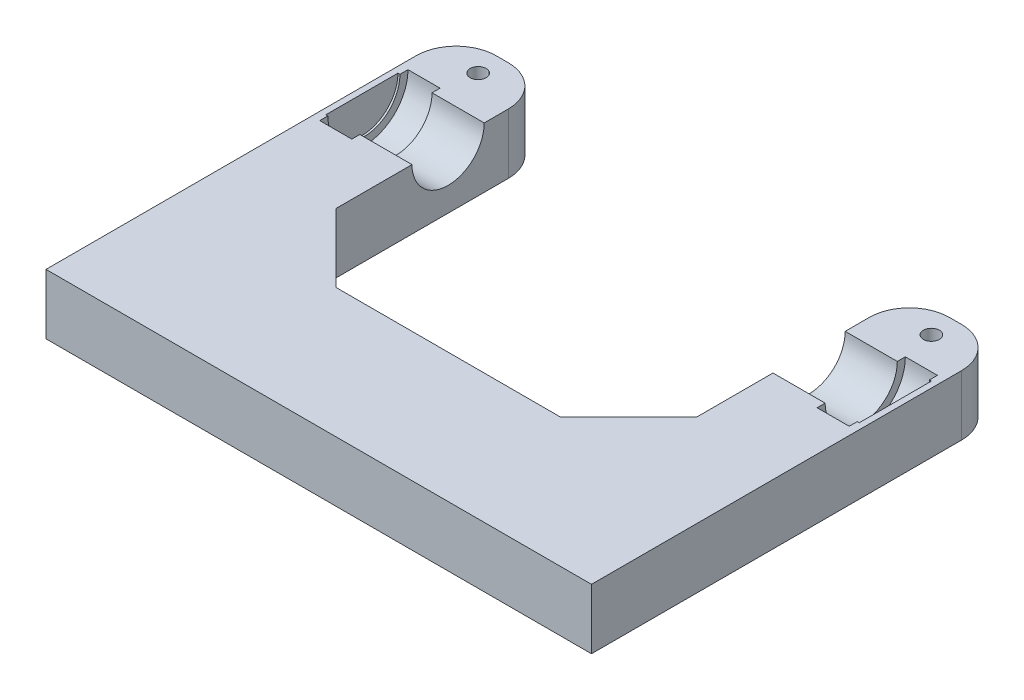
ISO-10303-21;
HEADER;
FILE_DESCRIPTION(('STEP AP214'),'2;1');
FILE_NAME('part.step','',(''),(''),'','','');
FILE_SCHEMA(('AUTOMOTIVE_DESIGN { 1 0 10303 214 1 1 1 1 }'));
ENDSEC;
DATA;
#1=APPLICATION_CONTEXT('core data for automotive mechanical design processes');
#2=APPLICATION_PROTOCOL_DEFINITION('international standard','automotive_design',2000,#1);
#3=PRODUCT_CONTEXT('',#1,'mechanical');
#4=PRODUCT('Part','Part','',(#3));
#5=PRODUCT_RELATED_PRODUCT_CATEGORY('part','',(#4));
#6=PRODUCT_DEFINITION_FORMATION('','',#4);
#7=PRODUCT_DEFINITION_CONTEXT('part definition',#1,'design');
#8=PRODUCT_DEFINITION('design','',#6,#7);
#9=PRODUCT_DEFINITION_SHAPE('','',#8);
#10=(LENGTH_UNIT() NAMED_UNIT(*) SI_UNIT(.MILLI.,.METRE.));
#11=(NAMED_UNIT(*) PLANE_ANGLE_UNIT() SI_UNIT($,.RADIAN.));
#12=(NAMED_UNIT(*) SI_UNIT($,.STERADIAN.) SOLID_ANGLE_UNIT());
#13=UNCERTAINTY_MEASURE_WITH_UNIT(LENGTH_MEASURE(1.E-05),#10,'distance_accuracy_value','');
#14=(GEOMETRIC_REPRESENTATION_CONTEXT(3) GLOBAL_UNCERTAINTY_ASSIGNED_CONTEXT((#13)) GLOBAL_UNIT_ASSIGNED_CONTEXT((#10,
#11,#12)) REPRESENTATION_CONTEXT('',''));
#15=CARTESIAN_POINT('',(0.,0.,0.));
#16=DIRECTION('',(0.,0.,1.));
#17=DIRECTION('',(1.,0.,0.));
#18=AXIS2_PLACEMENT_3D('',#15,#16,#17);
#19=CARTESIAN_POINT('',(0.,0.,0.));
#20=DIRECTION('',(0.,1.,0.));
#21=DIRECTION('',(0.,0.,1.));
#22=AXIS2_PLACEMENT_3D('',#19,#20,#21);
#23=PLANE('',#22);
#24=CARTESIAN_POINT('',(56.5,0.,-19.));
#25=DIRECTION('',(0.,-1.,0.));
#26=DIRECTION('',(0.,0.,1.));
#27=AXIS2_PLACEMENT_3D('',#24,#25,#26);
#28=CIRCLE('',#27,2.);
#29=CARTESIAN_POINT('',(56.5,0.,-17.));
#30=VERTEX_POINT('',#29);
#31=EDGE_CURVE('E478',#30,#30,#28,.T.);
#32=ORIENTED_EDGE('',*,*,#31,.T.);
#33=EDGE_LOOP('',(#32));
#34=FACE_BOUND('',#33,.T.);
#35=CARTESIAN_POINT('',(-56.5,0.,-19.));
#36=DIRECTION('',(0.,1.,0.));
#37=DIRECTION('',(0.,0.,1.));
#38=AXIS2_PLACEMENT_3D('',#35,#36,#37);
#39=CIRCLE('',#38,2.);
#40=CARTESIAN_POINT('',(-56.5,0.,-17.));
#41=VERTEX_POINT('',#40);
#42=EDGE_CURVE('E253',#41,#41,#39,.T.);
#43=ORIENTED_EDGE('',*,*,#42,.F.);
#44=EDGE_LOOP('',(#43));
#45=FACE_BOUND('',#44,.T.);
#46=DIRECTION('',(-1.,0.,0.));
#47=VECTOR('',#46,1.);
#48=CARTESIAN_POINT('',(66.,0.,-11.));
#49=LINE('',#48,#47);
#50=CARTESIAN_POINT('',(58.,0.,-11.));
#51=VERTEX_POINT('',#50);
#52=CARTESIAN_POINT('',(66.,0.,-11.));
#53=VERTEX_POINT('',#52);
#54=EDGE_CURVE('E11',#51,#53,#49,.F.);
#55=ORIENTED_EDGE('',*,*,#54,.T.);
#56=DIRECTION('',(0.,0.,1.));
#57=VECTOR('',#56,1.);
#58=CARTESIAN_POINT('',(66.,0.,0.));
#59=LINE('',#58,#57);
#60=CARTESIAN_POINT('',(66.,0.,-9.));
#61=VERTEX_POINT('',#60);
#62=EDGE_CURVE('E237',#53,#61,#59,.T.);
#63=ORIENTED_EDGE('',*,*,#62,.T.);
#64=DIRECTION('',(-1.,0.,0.));
#65=VECTOR('',#64,1.);
#66=CARTESIAN_POINT('',(66.5,0.,-9.));
#67=LINE('',#66,#65);
#68=CARTESIAN_POINT('',(66.5,0.,-9.));
#69=VERTEX_POINT('',#68);
#70=EDGE_CURVE('E250',#61,#69,#67,.F.);
#71=ORIENTED_EDGE('',*,*,#70,.T.);
#72=DIRECTION('',(0.,0.,1.));
#73=VECTOR('',#72,1.);
#74=CARTESIAN_POINT('',(66.5,0.,0.));
#75=LINE('',#74,#73);
#76=CARTESIAN_POINT('',(66.5,0.,9.));
#77=VERTEX_POINT('',#76);
#78=EDGE_CURVE('E462',#69,#77,#75,.T.);
#79=ORIENTED_EDGE('',*,*,#78,.T.);
#80=DIRECTION('',(-1.,0.,0.));
#81=VECTOR('',#80,1.);
#82=CARTESIAN_POINT('',(66.5,0.,9.));
#83=LINE('',#82,#81);
#84=CARTESIAN_POINT('',(66.,0.,9.));
#85=VERTEX_POINT('',#84);
#86=EDGE_CURVE('E246',#77,#85,#83,.T.);
#87=ORIENTED_EDGE('',*,*,#86,.T.);
#88=CARTESIAN_POINT('',(66.,0.,11.));
#89=VERTEX_POINT('',#88);
#90=EDGE_CURVE('E232',#85,#89,#59,.T.);
#91=ORIENTED_EDGE('',*,*,#90,.T.);
#92=DIRECTION('',(-1.,0.,0.));
#93=VECTOR('',#92,1.);
#94=CARTESIAN_POINT('',(66.,0.,11.));
#95=LINE('',#94,#93);
#96=CARTESIAN_POINT('',(58.,0.,11.));
#97=VERTEX_POINT('',#96);
#98=EDGE_CURVE('E50',#89,#97,#95,.T.);
#99=ORIENTED_EDGE('',*,*,#98,.T.);
#100=DIRECTION('',(0.,0.,1.));
#101=VECTOR('',#100,1.);
#102=CARTESIAN_POINT('',(58.,0.,0.));
#103=LINE('',#102,#101);
#104=CARTESIAN_POINT('',(58.,0.,9.));
#105=VERTEX_POINT('',#104);
#106=EDGE_CURVE('E226',#105,#97,#103,.T.);
#107=ORIENTED_EDGE('',*,*,#106,.F.);
#108=CARTESIAN_POINT('',(45.,0.,9.));
#109=VERTEX_POINT('',#108);
#110=EDGE_CURVE('E245',#105,#109,#83,.T.);
#111=ORIENTED_EDGE('',*,*,#110,.T.);
#112=DIRECTION('',(0.,0.,1.));
#113=VECTOR('',#112,1.);
#114=CARTESIAN_POINT('',(45.,0.,-25.));
#115=LINE('',#114,#113);
#116=CARTESIAN_POINT('',(45.,0.,27.9999999999999));
#117=VERTEX_POINT('',#116);
#118=EDGE_CURVE('E285',#109,#117,#115,.T.);
#119=ORIENTED_EDGE('',*,*,#118,.T.);
#120=DIRECTION('',(0.707106781186544,0.,-0.707106781186551));
#121=VECTOR('',#120,1.);
#122=CARTESIAN_POINT('',(45.,0.,27.9999999999999));
#123=LINE('',#122,#121);
#124=CARTESIAN_POINT('',(28.0000000000001,0.,45.));
#125=VERTEX_POINT('',#124);
#126=EDGE_CURVE('E394',#117,#125,#123,.F.);
#127=ORIENTED_EDGE('',*,*,#126,.T.);
#128=DIRECTION('',(-1.,0.,0.));
#129=VECTOR('',#128,1.);
#130=CARTESIAN_POINT('',(-45.,0.,45.));
#131=LINE('',#130,#129);
#132=CARTESIAN_POINT('',(-27.9999999999998,0.,45.));
#133=VERTEX_POINT('',#132);
#134=EDGE_CURVE('E321',#125,#133,#131,.T.);
#135=ORIENTED_EDGE('',*,*,#134,.T.);
#136=DIRECTION('',(0.707106781186551,0.,0.707106781186544));
#137=VECTOR('',#136,1.);
#138=CARTESIAN_POINT('',(-27.9999999999998,0.,45.));
#139=LINE('',#138,#137);
#140=CARTESIAN_POINT('',(-45.,0.,28.0000000000001));
#141=VERTEX_POINT('',#140);
#142=EDGE_CURVE('E401',#133,#141,#139,.F.);
#143=ORIENTED_EDGE('',*,*,#142,.T.);
#144=DIRECTION('',(0.,0.,-1.));
#145=VECTOR('',#144,1.);
#146=CARTESIAN_POINT('',(-45.,0.,45.));
#147=LINE('',#146,#145);
#148=CARTESIAN_POINT('',(-45.,0.,9.));
#149=VERTEX_POINT('',#148);
#150=EDGE_CURVE('E326',#141,#149,#147,.T.);
#151=ORIENTED_EDGE('',*,*,#150,.T.);
#152=DIRECTION('',(1.,0.,0.));
#153=VECTOR('',#152,1.);
#154=CARTESIAN_POINT('',(-66.5,0.,9.));
#155=LINE('',#154,#153);
#156=CARTESIAN_POINT('',(-58.,0.,9.));
#157=VERTEX_POINT('',#156);
#158=EDGE_CURVE('E362',#157,#149,#155,.T.);
#159=ORIENTED_EDGE('',*,*,#158,.F.);
#160=DIRECTION('',(0.,0.,-1.));
#161=VECTOR('',#160,1.);
#162=CARTESIAN_POINT('',(-58.,0.,0.));
#163=LINE('',#162,#161);
#164=CARTESIAN_POINT('',(-58.,0.,11.));
#165=VERTEX_POINT('',#164);
#166=EDGE_CURVE('E272',#165,#157,#163,.T.);
#167=ORIENTED_EDGE('',*,*,#166,.F.);
#168=DIRECTION('',(1.,0.,0.));
#169=VECTOR('',#168,1.);
#170=CARTESIAN_POINT('',(-66.,0.,11.));
#171=LINE('',#170,#169);
#172=CARTESIAN_POINT('',(-66.,0.,11.));
#173=VERTEX_POINT('',#172);
#174=EDGE_CURVE('E377',#173,#165,#171,.T.);
#175=ORIENTED_EDGE('',*,*,#174,.F.);
#176=DIRECTION('',(0.,0.,-1.));
#177=VECTOR('',#176,1.);
#178=CARTESIAN_POINT('',(-66.,0.,0.));
#179=LINE('',#178,#177);
#180=CARTESIAN_POINT('',(-66.,0.,9.));
#181=VERTEX_POINT('',#180);
#182=EDGE_CURVE('E277',#173,#181,#179,.T.);
#183=ORIENTED_EDGE('',*,*,#182,.T.);
#184=CARTESIAN_POINT('',(-66.5,0.,9.));
#185=VERTEX_POINT('',#184);
#186=EDGE_CURVE('E363',#185,#181,#155,.T.);
#187=ORIENTED_EDGE('',*,*,#186,.F.);
#188=DIRECTION('',(0.,0.,-1.));
#189=VECTOR('',#188,1.);
#190=CARTESIAN_POINT('',(-66.5,0.,0.));
#191=LINE('',#190,#189);
#192=CARTESIAN_POINT('',(-66.5,0.,-9.));
#193=VERTEX_POINT('',#192);
#194=EDGE_CURVE('E350',#185,#193,#191,.T.);
#195=ORIENTED_EDGE('',*,*,#194,.T.);
#196=DIRECTION('',(1.,0.,0.));
#197=VECTOR('',#196,1.);
#198=CARTESIAN_POINT('',(-66.5,0.,-9.));
#199=LINE('',#198,#197);
#200=CARTESIAN_POINT('',(-66.,0.,-9.));
#201=VERTEX_POINT('',#200);
#202=EDGE_CURVE('E357',#201,#193,#199,.F.);
#203=ORIENTED_EDGE('',*,*,#202,.F.);
#204=CARTESIAN_POINT('',(-66.,0.,-11.));
#205=VERTEX_POINT('',#204);
#206=EDGE_CURVE('E273',#201,#205,#179,.T.);
#207=ORIENTED_EDGE('',*,*,#206,.T.);
#208=DIRECTION('',(1.,0.,0.));
#209=VECTOR('',#208,1.);
#210=CARTESIAN_POINT('',(-66.,0.,-11.));
#211=LINE('',#210,#209);
#212=CARTESIAN_POINT('',(-58.,0.,-11.));
#213=VERTEX_POINT('',#212);
#214=EDGE_CURVE('E374',#213,#205,#211,.F.);
#215=ORIENTED_EDGE('',*,*,#214,.F.);
#216=CARTESIAN_POINT('',(-58.,0.,-9.));
#217=VERTEX_POINT('',#216);
#218=EDGE_CURVE('E266',#217,#213,#163,.T.);
#219=ORIENTED_EDGE('',*,*,#218,.F.);
#220=CARTESIAN_POINT('',(-45.,0.,-9.));
#221=VERTEX_POINT('',#220);
#222=EDGE_CURVE('E358',#221,#217,#199,.F.);
#223=ORIENTED_EDGE('',*,*,#222,.F.);
#224=CARTESIAN_POINT('',(-45.,0.,-15.));
#225=VERTEX_POINT('',#224);
#226=EDGE_CURVE('E325',#221,#225,#147,.T.);
#227=ORIENTED_EDGE('',*,*,#226,.T.);
#228=CARTESIAN_POINT('',(-55.,0.,-15.));
#229=DIRECTION('',(0.,1.,0.));
#230=DIRECTION('',(0.,0.,1.));
#231=AXIS2_PLACEMENT_3D('',#228,#229,#230);
#232=CIRCLE('',#231,10.);
#233=CARTESIAN_POINT('',(-55.,0.,-25.));
#234=VERTEX_POINT('',#233);
#235=EDGE_CURVE('E414',#225,#234,#232,.T.);
#236=ORIENTED_EDGE('',*,*,#235,.T.);
#237=DIRECTION('',(-1.,0.,0.));
#238=VECTOR('',#237,1.);
#239=CARTESIAN_POINT('',(-45.,0.,-25.));
#240=LINE('',#239,#238);
#241=CARTESIAN_POINT('',(-58.,0.,-25.));
#242=VERTEX_POINT('',#241);
#243=EDGE_CURVE('E329',#234,#242,#240,.T.);
#244=ORIENTED_EDGE('',*,*,#243,.T.);
#245=CARTESIAN_POINT('',(-58.,0.,-15.));
#246=DIRECTION('',(0.,1.,0.));
#247=DIRECTION('',(0.,0.,1.));
#248=AXIS2_PLACEMENT_3D('',#245,#246,#247);
#249=CIRCLE('',#248,10.);
#250=CARTESIAN_POINT('',(-67.9999999999999,0.,-15.));
#251=VERTEX_POINT('',#250);
#252=EDGE_CURVE('E411',#242,#251,#249,.T.);
#253=ORIENTED_EDGE('',*,*,#252,.T.);
#254=DIRECTION('',(0.,0.,1.));
#255=VECTOR('',#254,1.);
#256=CARTESIAN_POINT('',(-67.9999999999999,0.,-25.));
#257=LINE('',#256,#255);
#258=CARTESIAN_POINT('',(-67.9999999999999,0.,77.2494482032354));
#259=VERTEX_POINT('',#258);
#260=EDGE_CURVE('E333',#251,#259,#257,.T.);
#261=ORIENTED_EDGE('',*,*,#260,.T.);
#262=DIRECTION('',(1.,0.,0.));
#263=VECTOR('',#262,1.);
#264=CARTESIAN_POINT('',(-67.9999999999999,0.,77.2494482032354));
#265=LINE('',#264,#263);
#266=CARTESIAN_POINT('',(67.9999999999999,0.,77.2494482032354));
#267=VERTEX_POINT('',#266);
#268=EDGE_CURVE('E336',#259,#267,#265,.T.);
#269=ORIENTED_EDGE('',*,*,#268,.T.);
#270=DIRECTION('',(0.,0.,-1.));
#271=VECTOR('',#270,1.);
#272=CARTESIAN_POINT('',(67.9999999999999,0.,-25.));
#273=LINE('',#272,#271);
#274=CARTESIAN_POINT('',(67.9999999999999,0.,-15.));
#275=VERTEX_POINT('',#274);
#276=EDGE_CURVE('E340',#267,#275,#273,.T.);
#277=ORIENTED_EDGE('',*,*,#276,.T.);
#278=CARTESIAN_POINT('',(58.,0.,-15.));
#279=DIRECTION('',(0.,1.,0.));
#280=DIRECTION('',(0.,0.,1.));
#281=AXIS2_PLACEMENT_3D('',#278,#279,#280);
#282=CIRCLE('',#281,10.);
#283=CARTESIAN_POINT('',(58.,0.,-25.));
#284=VERTEX_POINT('',#283);
#285=EDGE_CURVE('E420',#275,#284,#282,.T.);
#286=ORIENTED_EDGE('',*,*,#285,.T.);
#287=DIRECTION('',(-1.,0.,0.));
#288=VECTOR('',#287,1.);
#289=CARTESIAN_POINT('',(45.,0.,-25.));
#290=LINE('',#289,#288);
#291=CARTESIAN_POINT('',(55.,0.,-25.));
#292=VERTEX_POINT('',#291);
#293=EDGE_CURVE('E290',#284,#292,#290,.T.);
#294=ORIENTED_EDGE('',*,*,#293,.T.);
#295=CARTESIAN_POINT('',(55.,0.,-15.));
#296=DIRECTION('',(0.,1.,0.));
#297=DIRECTION('',(0.,0.,1.));
#298=AXIS2_PLACEMENT_3D('',#295,#296,#297);
#299=CIRCLE('',#298,10.);
#300=CARTESIAN_POINT('',(45.,0.,-15.));
#301=VERTEX_POINT('',#300);
#302=EDGE_CURVE('E417',#292,#301,#299,.T.);
#303=ORIENTED_EDGE('',*,*,#302,.T.);
#304=CARTESIAN_POINT('',(45.,0.,-9.));
#305=VERTEX_POINT('',#304);
#306=EDGE_CURVE('E318',#301,#305,#115,.T.);
#307=ORIENTED_EDGE('',*,*,#306,.T.);
#308=CARTESIAN_POINT('',(58.,0.,-9.));
#309=VERTEX_POINT('',#308);
#310=EDGE_CURVE('E64',#305,#309,#67,.F.);
#311=ORIENTED_EDGE('',*,*,#310,.T.);
#312=EDGE_CURVE('E57',#51,#309,#103,.T.);
#313=ORIENTED_EDGE('',*,*,#312,.F.);
#314=EDGE_LOOP('',(#55,#63,#71,#79,#87,#91,#99,#107,#111,#119,#127,#135,#143,#151,#159,#167,
#175,#183,#187,#195,#203,#207,#215,#219,#223,#227,#236,#244,#253,#261,#269,#277,#286,#294,#303,
#307,#311,#313));
#315=FACE_BOUND('',#314,.T.);
#316=ADVANCED_FACE('F41',(#34,#45,#315),#23,.T.);
#317=CARTESIAN_POINT('',(66.5,0.,0.));
#318=DIRECTION('',(-1.,0.,0.));
#319=DIRECTION('',(0.,0.,1.));
#320=AXIS2_PLACEMENT_3D('',#317,#318,#319);
#321=CYLINDRICAL_SURFACE('',#320,9.);
#322=ORIENTED_EDGE('',*,*,#70,.F.);
#323=CARTESIAN_POINT('',(66.,0.,0.));
#324=DIRECTION('',(-1.,0.,0.));
#325=DIRECTION('',(0.,0.,1.));
#326=AXIS2_PLACEMENT_3D('',#323,#324,#325);
#327=CIRCLE('',#326,9.);
#328=EDGE_CURVE('E469',#61,#85,#327,.T.);
#329=ORIENTED_EDGE('',*,*,#328,.T.);
#330=ORIENTED_EDGE('',*,*,#86,.F.);
#331=CARTESIAN_POINT('',(66.5,0.,0.));
#332=DIRECTION('',(1.,0.,0.));
#333=DIRECTION('',(0.,0.,-1.));
#334=AXIS2_PLACEMENT_3D('',#331,#332,#333);
#335=CIRCLE('',#334,9.);
#336=EDGE_CURVE('E241',#77,#69,#335,.T.);
#337=ORIENTED_EDGE('',*,*,#336,.T.);
#338=EDGE_LOOP('',(#322,#329,#330,#337));
#339=FACE_BOUND('',#338,.T.);
#340=ADVANCED_FACE('F570',(#339),#321,.F.);
#341=CARTESIAN_POINT('',(-66.5,0.,0.));
#342=DIRECTION('',(1.,0.,0.));
#343=DIRECTION('',(0.,0.,-1.));
#344=AXIS2_PLACEMENT_3D('',#341,#342,#343);
#345=CYLINDRICAL_SURFACE('',#344,9.);
#346=CARTESIAN_POINT('',(-66.,0.,0.));
#347=DIRECTION('',(1.,0.,0.));
#348=DIRECTION('',(0.,0.,-1.));
#349=AXIS2_PLACEMENT_3D('',#346,#347,#348);
#350=CIRCLE('',#349,9.);
#351=EDGE_CURVE('E371',#201,#181,#350,.F.);
#352=ORIENTED_EDGE('',*,*,#351,.F.);
#353=ORIENTED_EDGE('',*,*,#202,.T.);
#354=CARTESIAN_POINT('',(-66.5,0.,0.));
#355=DIRECTION('',(1.,0.,0.));
#356=DIRECTION('',(0.,0.,-1.));
#357=AXIS2_PLACEMENT_3D('',#354,#355,#356);
#358=CIRCLE('',#357,9.);
#359=EDGE_CURVE('E278',#185,#193,#358,.T.);
#360=ORIENTED_EDGE('',*,*,#359,.F.);
#361=ORIENTED_EDGE('',*,*,#186,.T.);
#362=EDGE_LOOP('',(#352,#353,#360,#361));
#363=FACE_BOUND('',#362,.T.);
#364=ADVANCED_FACE('F597',(#363),#345,.F.);
#365=CARTESIAN_POINT('',(45.,-15.,-25.));
#366=DIRECTION('',(-1.,0.,0.));
#367=DIRECTION('',(0.,0.,1.));
#368=AXIS2_PLACEMENT_3D('',#365,#366,#367);
#369=PLANE('',#368);
#370=ORIENTED_EDGE('',*,*,#118,.F.);
#371=CARTESIAN_POINT('',(45.,0.,0.));
#372=DIRECTION('',(-1.,0.,0.));
#373=DIRECTION('',(0.,0.,1.));
#374=AXIS2_PLACEMENT_3D('',#371,#372,#373);
#375=CIRCLE('',#374,9.);
#376=EDGE_CURVE('E459',#109,#305,#375,.F.);
#377=ORIENTED_EDGE('',*,*,#376,.T.);
#378=ORIENTED_EDGE('',*,*,#306,.F.);
#379=DIRECTION('',(0.,1.,0.));
#380=VECTOR('',#379,1.);
#381=CARTESIAN_POINT('',(45.,-15.,-15.));
#382=LINE('',#381,#380);
#383=CARTESIAN_POINT('',(45.,-15.,-15.));
#384=VERTEX_POINT('',#383);
#385=EDGE_CURVE('E442',#301,#384,#382,.F.);
#386=ORIENTED_EDGE('',*,*,#385,.T.);
#387=DIRECTION('',(0.,0.,1.));
#388=VECTOR('',#387,1.);
#389=CARTESIAN_POINT('',(45.,-15.,-25.));
#390=LINE('',#389,#388);
#391=CARTESIAN_POINT('',(45.,-15.,27.9999999999999));
#392=VERTEX_POINT('',#391);
#393=EDGE_CURVE('E286',#384,#392,#390,.T.);
#394=ORIENTED_EDGE('',*,*,#393,.T.);
#395=DIRECTION('',(0.,1.,0.));
#396=VECTOR('',#395,1.);
#397=CARTESIAN_POINT('',(45.,0.,27.9999999999999));
#398=LINE('',#397,#396);
#399=EDGE_CURVE('E380',#392,#117,#398,.T.);
#400=ORIENTED_EDGE('',*,*,#399,.T.);
#401=EDGE_LOOP('',(#370,#377,#378,#386,#394,#400));
#402=FACE_BOUND('',#401,.T.);
#403=ADVANCED_FACE('F557',(#402),#369,.T.);
#404=CARTESIAN_POINT('',(45.,-15.,-25.));
#405=DIRECTION('',(0.,0.,-1.));
#406=DIRECTION('',(-1.,0.,0.));
#407=AXIS2_PLACEMENT_3D('',#404,#405,#406);
#408=PLANE('',#407);
#409=ORIENTED_EDGE('',*,*,#293,.F.);
#410=DIRECTION('',(0.,1.,0.));
#411=VECTOR('',#410,1.);
#412=CARTESIAN_POINT('',(58.,-15.,-25.));
#413=LINE('',#412,#411);
#414=CARTESIAN_POINT('',(58.,-15.,-25.));
#415=VERTEX_POINT('',#414);
#416=EDGE_CURVE('E427',#284,#415,#413,.F.);
#417=ORIENTED_EDGE('',*,*,#416,.T.);
#418=DIRECTION('',(-1.,0.,0.));
#419=VECTOR('',#418,1.);
#420=CARTESIAN_POINT('',(45.,-15.,-25.));
#421=LINE('',#420,#419);
#422=CARTESIAN_POINT('',(55.,-15.,-25.));
#423=VERTEX_POINT('',#422);
#424=EDGE_CURVE('E313',#415,#423,#421,.T.);
#425=ORIENTED_EDGE('',*,*,#424,.T.);
#426=DIRECTION('',(0.,1.,0.));
#427=VECTOR('',#426,1.);
#428=CARTESIAN_POINT('',(55.,-15.,-25.));
#429=LINE('',#428,#427);
#430=EDGE_CURVE('E423',#423,#292,#429,.T.);
#431=ORIENTED_EDGE('',*,*,#430,.T.);
#432=EDGE_LOOP('',(#409,#417,#425,#431));
#433=FACE_BOUND('',#432,.T.);
#434=ADVANCED_FACE('F562',(#433),#408,.T.);
#435=CARTESIAN_POINT('',(67.9999999999999,-15.,-25.));
#436=DIRECTION('',(1.,0.,0.));
#437=DIRECTION('',(0.,0.,-1.));
#438=AXIS2_PLACEMENT_3D('',#435,#436,#437);
#439=PLANE('',#438);
#440=DIRECTION('',(0.,0.,-1.));
#441=VECTOR('',#440,1.);
#442=CARTESIAN_POINT('',(67.9999999999999,-15.,-25.));
#443=LINE('',#442,#441);
#444=CARTESIAN_POINT('',(67.9999999999999,-15.,77.2494482032354));
#445=VERTEX_POINT('',#444);
#446=CARTESIAN_POINT('',(67.9999999999999,-15.,-15.));
#447=VERTEX_POINT('',#446);
#448=EDGE_CURVE('E309',#445,#447,#443,.T.);
#449=ORIENTED_EDGE('',*,*,#448,.T.);
#450=DIRECTION('',(0.,1.,0.));
#451=VECTOR('',#450,1.);
#452=CARTESIAN_POINT('',(67.9999999999999,-15.,-15.));
#453=LINE('',#452,#451);
#454=EDGE_CURVE('E407',#447,#275,#453,.T.);
#455=ORIENTED_EDGE('',*,*,#454,.T.);
#456=ORIENTED_EDGE('',*,*,#276,.F.);
#457=DIRECTION('',(0.,1.,0.));
#458=VECTOR('',#457,1.);
#459=CARTESIAN_POINT('',(67.9999999999999,-15.,77.2494482032354));
#460=LINE('',#459,#458);
#461=EDGE_CURVE('E347',#445,#267,#460,.T.);
#462=ORIENTED_EDGE('',*,*,#461,.F.);
#463=EDGE_LOOP('',(#449,#455,#456,#462));
#464=FACE_BOUND('',#463,.T.);
#465=ADVANCED_FACE('F510',(#464),#439,.T.);
#466=CARTESIAN_POINT('',(-67.9999999999999,-15.,77.2494482032354));
#467=DIRECTION('',(0.,0.,1.));
#468=DIRECTION('',(1.,0.,0.));
#469=AXIS2_PLACEMENT_3D('',#466,#467,#468);
#470=PLANE('',#469);
#471=ORIENTED_EDGE('',*,*,#268,.F.);
#472=DIRECTION('',(0.,1.,0.));
#473=VECTOR('',#472,1.);
#474=CARTESIAN_POINT('',(-67.9999999999999,-15.,77.2494482032354));
#475=LINE('',#474,#473);
#476=CARTESIAN_POINT('',(-67.9999999999999,-15.,77.2494482032354));
#477=VERTEX_POINT('',#476);
#478=EDGE_CURVE('E317',#477,#259,#475,.T.);
#479=ORIENTED_EDGE('',*,*,#478,.F.);
#480=DIRECTION('',(1.,0.,0.));
#481=VECTOR('',#480,1.);
#482=CARTESIAN_POINT('',(-67.9999999999999,-15.,77.2494482032354));
#483=LINE('',#482,#481);
#484=EDGE_CURVE('E305',#477,#445,#483,.T.);
#485=ORIENTED_EDGE('',*,*,#484,.T.);
#486=ORIENTED_EDGE('',*,*,#461,.T.);
#487=EDGE_LOOP('',(#471,#479,#485,#486));
#488=FACE_BOUND('',#487,.T.);
#489=ADVANCED_FACE('F516',(#488),#470,.T.);
#490=CARTESIAN_POINT('',(-67.9999999999999,-15.,-25.));
#491=DIRECTION('',(-1.,0.,0.));
#492=DIRECTION('',(0.,0.,1.));
#493=AXIS2_PLACEMENT_3D('',#490,#491,#492);
#494=PLANE('',#493);
#495=ORIENTED_EDGE('',*,*,#260,.F.);
#496=DIRECTION('',(0.,1.,0.));
#497=VECTOR('',#496,1.);
#498=CARTESIAN_POINT('',(-67.9999999999999,-15.,-15.));
#499=LINE('',#498,#497);
#500=CARTESIAN_POINT('',(-67.9999999999999,-15.,-15.));
#501=VERTEX_POINT('',#500);
#502=EDGE_CURVE('E456',#251,#501,#499,.F.);
#503=ORIENTED_EDGE('',*,*,#502,.T.);
#504=DIRECTION('',(0.,0.,1.));
#505=VECTOR('',#504,1.);
#506=CARTESIAN_POINT('',(-67.9999999999999,-15.,-25.));
#507=LINE('',#506,#505);
#508=EDGE_CURVE('E302',#501,#477,#507,.T.);
#509=ORIENTED_EDGE('',*,*,#508,.T.);
#510=ORIENTED_EDGE('',*,*,#478,.T.);
#511=EDGE_LOOP('',(#495,#503,#509,#510));
#512=FACE_BOUND('',#511,.T.);
#513=ADVANCED_FACE('F625',(#512),#494,.T.);
#514=CARTESIAN_POINT('',(-45.,-15.,-25.));
#515=DIRECTION('',(0.,0.,-1.));
#516=DIRECTION('',(-1.,0.,0.));
#517=AXIS2_PLACEMENT_3D('',#514,#515,#516);
#518=PLANE('',#517);
#519=ORIENTED_EDGE('',*,*,#243,.F.);
#520=DIRECTION('',(0.,1.,0.));
#521=VECTOR('',#520,1.);
#522=CARTESIAN_POINT('',(-55.,-15.,-25.));
#523=LINE('',#522,#521);
#524=CARTESIAN_POINT('',(-55.,-15.,-25.));
#525=VERTEX_POINT('',#524);
#526=EDGE_CURVE('E453',#234,#525,#523,.F.);
#527=ORIENTED_EDGE('',*,*,#526,.T.);
#528=DIRECTION('',(-1.,0.,0.));
#529=VECTOR('',#528,1.);
#530=CARTESIAN_POINT('',(-45.,-15.,-25.));
#531=LINE('',#530,#529);
#532=CARTESIAN_POINT('',(-58.,-15.,-25.));
#533=VERTEX_POINT('',#532);
#534=EDGE_CURVE('E298',#525,#533,#531,.T.);
#535=ORIENTED_EDGE('',*,*,#534,.T.);
#536=DIRECTION('',(0.,1.,0.));
#537=VECTOR('',#536,1.);
#538=CARTESIAN_POINT('',(-58.,-15.,-25.));
#539=LINE('',#538,#537);
#540=EDGE_CURVE('E449',#533,#242,#539,.T.);
#541=ORIENTED_EDGE('',*,*,#540,.T.);
#542=EDGE_LOOP('',(#519,#527,#535,#541));
#543=FACE_BOUND('',#542,.T.);
#544=ADVANCED_FACE('F527',(#543),#518,.T.);
#545=CARTESIAN_POINT('',(-45.,-15.,45.));
#546=DIRECTION('',(1.,0.,0.));
#547=DIRECTION('',(0.,0.,-1.));
#548=AXIS2_PLACEMENT_3D('',#545,#546,#547);
#549=PLANE('',#548);
#550=DIRECTION('',(0.,0.,-1.));
#551=VECTOR('',#550,1.);
#552=CARTESIAN_POINT('',(-45.,-15.,45.));
#553=LINE('',#552,#551);
#554=CARTESIAN_POINT('',(-45.,-15.,28.0000000000001));
#555=VERTEX_POINT('',#554);
#556=CARTESIAN_POINT('',(-45.,-15.,-15.));
#557=VERTEX_POINT('',#556);
#558=EDGE_CURVE('E294',#555,#557,#553,.T.);
#559=ORIENTED_EDGE('',*,*,#558,.T.);
#560=DIRECTION('',(0.,1.,0.));
#561=VECTOR('',#560,1.);
#562=CARTESIAN_POINT('',(-45.,-15.,-15.));
#563=LINE('',#562,#561);
#564=EDGE_CURVE('E445',#557,#225,#563,.T.);
#565=ORIENTED_EDGE('',*,*,#564,.T.);
#566=ORIENTED_EDGE('',*,*,#226,.F.);
#567=CARTESIAN_POINT('',(-45.,0.,0.));
#568=DIRECTION('',(1.,0.,0.));
#569=DIRECTION('',(0.,0.,-1.));
#570=AXIS2_PLACEMENT_3D('',#567,#568,#569);
#571=CIRCLE('',#570,9.);
#572=EDGE_CURVE('E282',#149,#221,#571,.T.);
#573=ORIENTED_EDGE('',*,*,#572,.F.);
#574=ORIENTED_EDGE('',*,*,#150,.F.);
#575=DIRECTION('',(0.,-1.,0.));
#576=VECTOR('',#575,1.);
#577=CARTESIAN_POINT('',(-45.,-15.,28.0000000000001));
#578=LINE('',#577,#576);
#579=EDGE_CURVE('E391',#141,#555,#578,.T.);
#580=ORIENTED_EDGE('',*,*,#579,.T.);
#581=EDGE_LOOP('',(#559,#565,#566,#573,#574,#580));
#582=FACE_BOUND('',#581,.T.);
#583=ADVANCED_FACE('F537',(#582),#549,.T.);
#584=CARTESIAN_POINT('',(-45.,-15.,45.));
#585=DIRECTION('',(0.,0.,-1.));
#586=DIRECTION('',(-1.,0.,0.));
#587=AXIS2_PLACEMENT_3D('',#584,#585,#586);
#588=PLANE('',#587);
#589=ORIENTED_EDGE('',*,*,#134,.F.);
#590=DIRECTION('',(0.,-1.,0.));
#591=VECTOR('',#590,1.);
#592=CARTESIAN_POINT('',(28.0000000000001,-15.,45.));
#593=LINE('',#592,#591);
#594=CARTESIAN_POINT('',(28.0000000000001,-15.,45.));
#595=VERTEX_POINT('',#594);
#596=EDGE_CURVE('E388',#125,#595,#593,.T.);
#597=ORIENTED_EDGE('',*,*,#596,.T.);
#598=DIRECTION('',(-1.,0.,0.));
#599=VECTOR('',#598,1.);
#600=CARTESIAN_POINT('',(-45.,-15.,45.));
#601=LINE('',#600,#599);
#602=CARTESIAN_POINT('',(-27.9999999999998,-15.,45.));
#603=VERTEX_POINT('',#602);
#604=EDGE_CURVE('E289',#595,#603,#601,.T.);
#605=ORIENTED_EDGE('',*,*,#604,.T.);
#606=DIRECTION('',(0.,1.,0.));
#607=VECTOR('',#606,1.);
#608=CARTESIAN_POINT('',(-27.9999999999998,0.,45.));
#609=LINE('',#608,#607);
#610=EDGE_CURVE('E384',#603,#133,#609,.T.);
#611=ORIENTED_EDGE('',*,*,#610,.T.);
#612=EDGE_LOOP('',(#589,#597,#605,#611));
#613=FACE_BOUND('',#612,.T.);
#614=ADVANCED_FACE('F493',(#613),#588,.T.);
#615=CARTESIAN_POINT('',(0.,-15.,0.));
#616=DIRECTION('',(0.,1.,0.));
#617=DIRECTION('',(0.,0.,1.));
#618=AXIS2_PLACEMENT_3D('',#615,#616,#617);
#619=PLANE('',#618);
#620=CARTESIAN_POINT('',(56.5,-15.,-19.));
#621=DIRECTION('',(0.,-1.,0.));
#622=DIRECTION('',(0.,0.,1.));
#623=AXIS2_PLACEMENT_3D('',#620,#621,#622);
#624=CIRCLE('',#623,2.);
#625=CARTESIAN_POINT('',(56.5,-15.,-17.));
#626=VERTEX_POINT('',#625);
#627=EDGE_CURVE('E228',#626,#626,#624,.T.);
#628=ORIENTED_EDGE('',*,*,#627,.F.);
#629=EDGE_LOOP('',(#628));
#630=FACE_BOUND('',#629,.T.);
#631=CARTESIAN_POINT('',(-56.5,-15.,-19.));
#632=DIRECTION('',(0.,1.,0.));
#633=DIRECTION('',(0.,0.,1.));
#634=AXIS2_PLACEMENT_3D('',#631,#632,#633);
#635=CIRCLE('',#634,2.);
#636=CARTESIAN_POINT('',(-56.5,-15.,-17.));
#637=VERTEX_POINT('',#636);
#638=EDGE_CURVE('E254',#637,#637,#635,.T.);
#639=ORIENTED_EDGE('',*,*,#638,.T.);
#640=EDGE_LOOP('',(#639));
#641=FACE_BOUND('',#640,.T.);
#642=ORIENTED_EDGE('',*,*,#424,.F.);
#643=CARTESIAN_POINT('',(58.,-15.,-15.));
#644=DIRECTION('',(0.,1.,0.));
#645=DIRECTION('',(0.,0.,1.));
#646=AXIS2_PLACEMENT_3D('',#643,#644,#645);
#647=CIRCLE('',#646,10.);
#648=EDGE_CURVE('E439',#415,#447,#647,.F.);
#649=ORIENTED_EDGE('',*,*,#648,.T.);
#650=ORIENTED_EDGE('',*,*,#448,.F.);
#651=ORIENTED_EDGE('',*,*,#484,.F.);
#652=ORIENTED_EDGE('',*,*,#508,.F.);
#653=CARTESIAN_POINT('',(-58.,-15.,-15.));
#654=DIRECTION('',(0.,1.,0.));
#655=DIRECTION('',(0.,0.,1.));
#656=AXIS2_PLACEMENT_3D('',#653,#654,#655);
#657=CIRCLE('',#656,10.);
#658=EDGE_CURVE('E430',#501,#533,#657,.F.);
#659=ORIENTED_EDGE('',*,*,#658,.T.);
#660=ORIENTED_EDGE('',*,*,#534,.F.);
#661=CARTESIAN_POINT('',(-55.,-15.,-15.));
#662=DIRECTION('',(0.,1.,0.));
#663=DIRECTION('',(0.,0.,1.));
#664=AXIS2_PLACEMENT_3D('',#661,#662,#663);
#665=CIRCLE('',#664,10.);
#666=EDGE_CURVE('E433',#525,#557,#665,.F.);
#667=ORIENTED_EDGE('',*,*,#666,.T.);
#668=ORIENTED_EDGE('',*,*,#558,.F.);
#669=DIRECTION('',(-0.707106781186551,0.,-0.707106781186544));
#670=VECTOR('',#669,1.);
#671=CARTESIAN_POINT('',(-36.4999999999998,-15.,36.5000000000001));
#672=LINE('',#671,#670);
#673=EDGE_CURVE('E404',#555,#603,#672,.F.);
#674=ORIENTED_EDGE('',*,*,#673,.T.);
#675=ORIENTED_EDGE('',*,*,#604,.F.);
#676=DIRECTION('',(-0.707106781186544,0.,0.707106781186551));
#677=VECTOR('',#676,1.);
#678=CARTESIAN_POINT('',(36.5000000000002,-15.,36.4999999999998));
#679=LINE('',#678,#677);
#680=EDGE_CURVE('E397',#595,#392,#679,.F.);
#681=ORIENTED_EDGE('',*,*,#680,.T.);
#682=ORIENTED_EDGE('',*,*,#393,.F.);
#683=CARTESIAN_POINT('',(55.,-15.,-15.));
#684=DIRECTION('',(0.,1.,0.));
#685=DIRECTION('',(0.,0.,1.));
#686=AXIS2_PLACEMENT_3D('',#683,#684,#685);
#687=CIRCLE('',#686,10.);
#688=EDGE_CURVE('E436',#384,#423,#687,.F.);
#689=ORIENTED_EDGE('',*,*,#688,.T.);
#690=EDGE_LOOP('',(#642,#649,#650,#651,#652,#659,#660,#667,#668,#674,#675,#681,#682,#689));
#691=FACE_BOUND('',#690,.T.);
#692=ADVANCED_FACE('F489',(#630,#641,#691),#619,.F.);
#693=ORIENTED_EDGE('',*,*,#222,.T.);
#694=CARTESIAN_POINT('',(-58.,0.,0.));
#695=DIRECTION('',(1.,0.,0.));
#696=DIRECTION('',(0.,0.,-1.));
#697=AXIS2_PLACEMENT_3D('',#694,#695,#696);
#698=CIRCLE('',#697,9.);
#699=EDGE_CURVE('E367',#217,#157,#698,.F.);
#700=ORIENTED_EDGE('',*,*,#699,.T.);
#701=ORIENTED_EDGE('',*,*,#158,.T.);
#702=ORIENTED_EDGE('',*,*,#572,.T.);
#703=EDGE_LOOP('',(#693,#700,#701,#702));
#704=FACE_BOUND('',#703,.T.);
#705=ADVANCED_FACE('F492',(#704),#345,.F.);
#706=CARTESIAN_POINT('',(-66.5,0.,0.));
#707=DIRECTION('',(1.,0.,0.));
#708=DIRECTION('',(0.,0.,-1.));
#709=AXIS2_PLACEMENT_3D('',#706,#707,#708);
#710=PLANE('',#709);
#711=ORIENTED_EDGE('',*,*,#359,.T.);
#712=ORIENTED_EDGE('',*,*,#194,.F.);
#713=EDGE_LOOP('',(#711,#712));
#714=FACE_BOUND('',#713,.T.);
#715=ADVANCED_FACE('F601',(#714),#710,.T.);
#716=CARTESIAN_POINT('',(-66.,0.,0.));
#717=DIRECTION('',(1.,0.,0.));
#718=DIRECTION('',(0.,0.,-1.));
#719=AXIS2_PLACEMENT_3D('',#716,#717,#718);
#720=CYLINDRICAL_SURFACE('',#719,11.);
#721=ORIENTED_EDGE('',*,*,#174,.T.);
#722=CARTESIAN_POINT('',(-58.,0.,0.));
#723=DIRECTION('',(1.,0.,0.));
#724=DIRECTION('',(0.,0.,-1.));
#725=AXIS2_PLACEMENT_3D('',#722,#723,#724);
#726=CIRCLE('',#725,11.);
#727=EDGE_CURVE('E258',#165,#213,#726,.T.);
#728=ORIENTED_EDGE('',*,*,#727,.T.);
#729=ORIENTED_EDGE('',*,*,#214,.T.);
#730=CARTESIAN_POINT('',(-66.,0.,0.));
#731=DIRECTION('',(1.,0.,0.));
#732=DIRECTION('',(0.,0.,-1.));
#733=AXIS2_PLACEMENT_3D('',#730,#731,#732);
#734=CIRCLE('',#733,11.);
#735=EDGE_CURVE('E262',#173,#205,#734,.T.);
#736=ORIENTED_EDGE('',*,*,#735,.F.);
#737=EDGE_LOOP('',(#721,#728,#729,#736));
#738=FACE_BOUND('',#737,.T.);
#739=ADVANCED_FACE('F590',(#738),#720,.F.);
#740=CARTESIAN_POINT('',(-66.,0.,0.));
#741=DIRECTION('',(1.,0.,0.));
#742=DIRECTION('',(0.,0.,-1.));
#743=AXIS2_PLACEMENT_3D('',#740,#741,#742);
#744=PLANE('',#743);
#745=ORIENTED_EDGE('',*,*,#735,.T.);
#746=ORIENTED_EDGE('',*,*,#206,.F.);
#747=ORIENTED_EDGE('',*,*,#351,.T.);
#748=ORIENTED_EDGE('',*,*,#182,.F.);
#749=EDGE_LOOP('',(#745,#746,#747,#748));
#750=FACE_BOUND('',#749,.T.);
#751=ADVANCED_FACE('F595',(#750),#744,.T.);
#752=CARTESIAN_POINT('',(-58.,0.,0.));
#753=DIRECTION('',(1.,0.,0.));
#754=DIRECTION('',(0.,0.,-1.));
#755=AXIS2_PLACEMENT_3D('',#752,#753,#754);
#756=PLANE('',#755);
#757=ORIENTED_EDGE('',*,*,#166,.T.);
#758=ORIENTED_EDGE('',*,*,#699,.F.);
#759=ORIENTED_EDGE('',*,*,#218,.T.);
#760=ORIENTED_EDGE('',*,*,#727,.F.);
#761=EDGE_LOOP('',(#757,#758,#759,#760));
#762=FACE_BOUND('',#761,.T.);
#763=ADVANCED_FACE('F586',(#762),#756,.F.);
#764=CARTESIAN_POINT('',(45.,-15.,27.9999999999999));
#765=DIRECTION('',(-0.707106781186551,0.,-0.707106781186544));
#766=DIRECTION('',(0.,-1.,0.));
#767=AXIS2_PLACEMENT_3D('',#764,#765,#766);
#768=PLANE('',#767);
#769=ORIENTED_EDGE('',*,*,#680,.F.);
#770=ORIENTED_EDGE('',*,*,#596,.F.);
#771=ORIENTED_EDGE('',*,*,#126,.F.);
#772=ORIENTED_EDGE('',*,*,#399,.F.);
#773=EDGE_LOOP('',(#769,#770,#771,#772));
#774=FACE_BOUND('',#773,.T.);
#775=ADVANCED_FACE('F555',(#774),#768,.T.);
#776=CARTESIAN_POINT('',(-27.9999999999998,-15.,45.));
#777=DIRECTION('',(0.707106781186544,0.,-0.707106781186551));
#778=DIRECTION('',(0.,-1.,0.));
#779=AXIS2_PLACEMENT_3D('',#776,#777,#778);
#780=PLANE('',#779);
#781=ORIENTED_EDGE('',*,*,#673,.F.);
#782=ORIENTED_EDGE('',*,*,#579,.F.);
#783=ORIENTED_EDGE('',*,*,#142,.F.);
#784=ORIENTED_EDGE('',*,*,#610,.F.);
#785=EDGE_LOOP('',(#781,#782,#783,#784));
#786=FACE_BOUND('',#785,.T.);
#787=ADVANCED_FACE('F546',(#786),#780,.T.);
#788=CARTESIAN_POINT('',(-56.5,-15.,-19.));
#789=DIRECTION('',(0.,1.,0.));
#790=DIRECTION('',(0.,0.,1.));
#791=AXIS2_PLACEMENT_3D('',#788,#789,#790);
#792=CYLINDRICAL_SURFACE('',#791,2.);
#793=ORIENTED_EDGE('',*,*,#638,.F.);
#794=EDGE_LOOP('',(#793));
#795=FACE_BOUND('',#794,.T.);
#796=ORIENTED_EDGE('',*,*,#42,.T.);
#797=EDGE_LOOP('',(#796));
#798=FACE_BOUND('',#797,.T.);
#799=ADVANCED_FACE('F646',(#795,#798),#792,.F.);
#800=CARTESIAN_POINT('',(58.,-15.,-15.));
#801=DIRECTION('',(0.,1.,0.));
#802=DIRECTION('',(0.,0.,1.));
#803=AXIS2_PLACEMENT_3D('',#800,#801,#802);
#804=CYLINDRICAL_SURFACE('',#803,10.);
#805=ORIENTED_EDGE('',*,*,#648,.F.);
#806=ORIENTED_EDGE('',*,*,#416,.F.);
#807=ORIENTED_EDGE('',*,*,#285,.F.);
#808=ORIENTED_EDGE('',*,*,#454,.F.);
#809=EDGE_LOOP('',(#805,#806,#807,#808));
#810=FACE_BOUND('',#809,.T.);
#811=ADVANCED_FACE('F507',(#810),#804,.T.);
#812=CARTESIAN_POINT('',(55.,-15.,-15.));
#813=DIRECTION('',(0.,1.,0.));
#814=DIRECTION('',(0.,0.,1.));
#815=AXIS2_PLACEMENT_3D('',#812,#813,#814);
#816=CYLINDRICAL_SURFACE('',#815,10.);
#817=ORIENTED_EDGE('',*,*,#688,.F.);
#818=ORIENTED_EDGE('',*,*,#385,.F.);
#819=ORIENTED_EDGE('',*,*,#302,.F.);
#820=ORIENTED_EDGE('',*,*,#430,.F.);
#821=EDGE_LOOP('',(#817,#818,#819,#820));
#822=FACE_BOUND('',#821,.T.);
#823=ADVANCED_FACE('F561',(#822),#816,.T.);
#824=CARTESIAN_POINT('',(-55.,-15.,-15.));
#825=DIRECTION('',(0.,1.,0.));
#826=DIRECTION('',(0.,0.,1.));
#827=AXIS2_PLACEMENT_3D('',#824,#825,#826);
#828=CYLINDRICAL_SURFACE('',#827,10.);
#829=ORIENTED_EDGE('',*,*,#666,.F.);
#830=ORIENTED_EDGE('',*,*,#526,.F.);
#831=ORIENTED_EDGE('',*,*,#235,.F.);
#832=ORIENTED_EDGE('',*,*,#564,.F.);
#833=EDGE_LOOP('',(#829,#830,#831,#832));
#834=FACE_BOUND('',#833,.T.);
#835=ADVANCED_FACE('F535',(#834),#828,.T.);
#836=CARTESIAN_POINT('',(-58.,-15.,-15.));
#837=DIRECTION('',(0.,1.,0.));
#838=DIRECTION('',(0.,0.,1.));
#839=AXIS2_PLACEMENT_3D('',#836,#837,#838);
#840=CYLINDRICAL_SURFACE('',#839,10.);
#841=ORIENTED_EDGE('',*,*,#658,.F.);
#842=ORIENTED_EDGE('',*,*,#502,.F.);
#843=ORIENTED_EDGE('',*,*,#252,.F.);
#844=ORIENTED_EDGE('',*,*,#540,.F.);
#845=EDGE_LOOP('',(#841,#842,#843,#844));
#846=FACE_BOUND('',#845,.T.);
#847=ADVANCED_FACE('F43',(#846),#840,.T.);
#848=CARTESIAN_POINT('',(58.,0.,0.));
#849=DIRECTION('',(-1.,0.,0.));
#850=DIRECTION('',(0.,0.,1.));
#851=AXIS2_PLACEMENT_3D('',#848,#849,#850);
#852=CIRCLE('',#851,9.);
#853=EDGE_CURVE('E466',#309,#105,#852,.T.);
#854=ORIENTED_EDGE('',*,*,#853,.F.);
#855=ORIENTED_EDGE('',*,*,#310,.F.);
#856=ORIENTED_EDGE('',*,*,#376,.F.);
#857=ORIENTED_EDGE('',*,*,#110,.F.);
#858=EDGE_LOOP('',(#854,#855,#856,#857));
#859=FACE_BOUND('',#858,.T.);
#860=ADVANCED_FACE('F563',(#859),#321,.F.);
#861=CARTESIAN_POINT('',(66.5,0.,0.));
#862=DIRECTION('',(-1.,0.,0.));
#863=DIRECTION('',(0.,0.,-1.));
#864=AXIS2_PLACEMENT_3D('',#861,#862,#863);
#865=PLANE('',#864);
#866=ORIENTED_EDGE('',*,*,#336,.F.);
#867=ORIENTED_EDGE('',*,*,#78,.F.);
#868=EDGE_LOOP('',(#866,#867));
#869=FACE_BOUND('',#868,.T.);
#870=ADVANCED_FACE('F657',(#869),#865,.T.);
#871=CARTESIAN_POINT('',(66.,0.,0.));
#872=DIRECTION('',(-1.,0.,0.));
#873=DIRECTION('',(0.,0.,1.));
#874=AXIS2_PLACEMENT_3D('',#871,#872,#873);
#875=CYLINDRICAL_SURFACE('',#874,11.);
#876=CARTESIAN_POINT('',(58.,0.,0.));
#877=DIRECTION('',(1.,0.,0.));
#878=DIRECTION('',(0.,0.,-1.));
#879=AXIS2_PLACEMENT_3D('',#876,#877,#878);
#880=CIRCLE('',#879,11.);
#881=EDGE_CURVE('E218',#97,#51,#880,.T.);
#882=ORIENTED_EDGE('',*,*,#881,.F.);
#883=ORIENTED_EDGE('',*,*,#98,.F.);
#884=CARTESIAN_POINT('',(66.,0.,0.));
#885=DIRECTION('',(1.,0.,0.));
#886=DIRECTION('',(0.,0.,-1.));
#887=AXIS2_PLACEMENT_3D('',#884,#885,#886);
#888=CIRCLE('',#887,11.);
#889=EDGE_CURVE('E221',#89,#53,#888,.T.);
#890=ORIENTED_EDGE('',*,*,#889,.T.);
#891=ORIENTED_EDGE('',*,*,#54,.F.);
#892=EDGE_LOOP('',(#882,#883,#890,#891));
#893=FACE_BOUND('',#892,.T.);
#894=ADVANCED_FACE('F217',(#893),#875,.F.);
#895=CARTESIAN_POINT('',(66.,0.,0.));
#896=DIRECTION('',(-1.,0.,0.));
#897=DIRECTION('',(0.,0.,-1.));
#898=AXIS2_PLACEMENT_3D('',#895,#896,#897);
#899=PLANE('',#898);
#900=ORIENTED_EDGE('',*,*,#889,.F.);
#901=ORIENTED_EDGE('',*,*,#90,.F.);
#902=ORIENTED_EDGE('',*,*,#328,.F.);
#903=ORIENTED_EDGE('',*,*,#62,.F.);
#904=EDGE_LOOP('',(#900,#901,#902,#903));
#905=FACE_BOUND('',#904,.T.);
#906=ADVANCED_FACE('F475',(#905),#899,.T.);
#907=CARTESIAN_POINT('',(58.,0.,0.));
#908=DIRECTION('',(-1.,0.,0.));
#909=DIRECTION('',(0.,0.,-1.));
#910=AXIS2_PLACEMENT_3D('',#907,#908,#909);
#911=PLANE('',#910);
#912=ORIENTED_EDGE('',*,*,#312,.T.);
#913=ORIENTED_EDGE('',*,*,#853,.T.);
#914=ORIENTED_EDGE('',*,*,#106,.T.);
#915=ORIENTED_EDGE('',*,*,#881,.T.);
#916=EDGE_LOOP('',(#912,#913,#914,#915));
#917=FACE_BOUND('',#916,.T.);
#918=ADVANCED_FACE('F224',(#917),#911,.F.);
#919=CARTESIAN_POINT('',(56.5,-15.,-19.));
#920=DIRECTION('',(0.,1.,0.));
#921=DIRECTION('',(0.,0.,1.));
#922=AXIS2_PLACEMENT_3D('',#919,#920,#921);
#923=CYLINDRICAL_SURFACE('',#922,2.);
#924=ORIENTED_EDGE('',*,*,#627,.T.);
#925=EDGE_LOOP('',(#924));
#926=FACE_BOUND('',#925,.T.);
#927=ORIENTED_EDGE('',*,*,#31,.F.);
#928=EDGE_LOOP('',(#927));
#929=FACE_BOUND('',#928,.T.);
#930=ADVANCED_FACE('F486',(#926,#929),#923,.F.);
#931=CLOSED_SHELL('',(#316,#340,#364,#403,#434,#465,#489,#513,#544,#583,#614,#692,#705,#715,
#739,#751,#763,#775,#787,#799,#811,#823,#835,#847,#860,#870,#894,#906,#918,#930));
#932=MANIFOLD_SOLID_BREP('B2',#931);
#933=ADVANCED_BREP_SHAPE_REPRESENTATION('',(#18,#932),#14);
#934=SHAPE_DEFINITION_REPRESENTATION(#9,#933);
ENDSEC;
END-ISO-10303-21;
